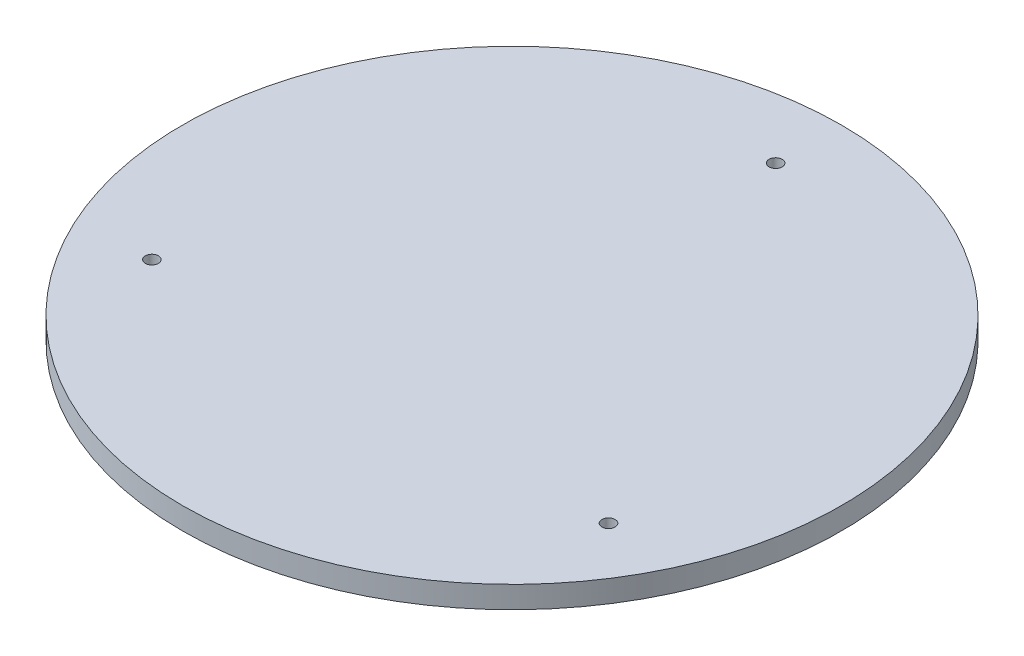
ISO-10303-21;
HEADER;
FILE_DESCRIPTION(('STEP AP214'),'2;1');
FILE_NAME('part.step','',(''),(''),'','','');
FILE_SCHEMA(('AUTOMOTIVE_DESIGN { 1 0 10303 214 1 1 1 1 }'));
ENDSEC;
DATA;
#1=APPLICATION_CONTEXT('core data for automotive mechanical design processes');
#2=APPLICATION_PROTOCOL_DEFINITION('international standard','automotive_design',2000,#1);
#3=PRODUCT_CONTEXT('',#1,'mechanical');
#4=PRODUCT('Part','Part','',(#3));
#5=PRODUCT_RELATED_PRODUCT_CATEGORY('part','',(#4));
#6=PRODUCT_DEFINITION_FORMATION('','',#4);
#7=PRODUCT_DEFINITION_CONTEXT('part definition',#1,'design');
#8=PRODUCT_DEFINITION('design','',#6,#7);
#9=PRODUCT_DEFINITION_SHAPE('','',#8);
#10=(LENGTH_UNIT() NAMED_UNIT(*) SI_UNIT(.MILLI.,.METRE.));
#11=(NAMED_UNIT(*) PLANE_ANGLE_UNIT() SI_UNIT($,.RADIAN.));
#12=(NAMED_UNIT(*) SI_UNIT($,.STERADIAN.) SOLID_ANGLE_UNIT());
#13=UNCERTAINTY_MEASURE_WITH_UNIT(LENGTH_MEASURE(1.E-05),#10,'distance_accuracy_value','');
#14=(GEOMETRIC_REPRESENTATION_CONTEXT(3) GLOBAL_UNCERTAINTY_ASSIGNED_CONTEXT((#13)) GLOBAL_UNIT_ASSIGNED_CONTEXT((#10,
#11,#12)) REPRESENTATION_CONTEXT('',''));
#15=CARTESIAN_POINT('',(0.,0.,0.));
#16=DIRECTION('',(0.,0.,1.));
#17=DIRECTION('',(1.,0.,0.));
#18=AXIS2_PLACEMENT_3D('',#15,#16,#17);
#19=CARTESIAN_POINT('',(0.,5.,0.));
#20=DIRECTION('',(0.,-1.,0.));
#21=DIRECTION('',(0.,0.,-1.));
#22=AXIS2_PLACEMENT_3D('',#19,#20,#21);
#23=CYLINDRICAL_SURFACE('',#22,75.);
#24=CARTESIAN_POINT('',(0.,5.,0.));
#25=DIRECTION('',(0.,1.,0.));
#26=DIRECTION('',(0.,0.,1.));
#27=AXIS2_PLACEMENT_3D('',#24,#25,#26);
#28=CIRCLE('',#27,75.);
#29=CARTESIAN_POINT('',(0.,5.,75.));
#30=VERTEX_POINT('',#29);
#31=EDGE_CURVE('E10',#30,#30,#28,.T.);
#32=ORIENTED_EDGE('',*,*,#31,.F.);
#33=EDGE_LOOP('',(#32));
#34=FACE_BOUND('',#33,.T.);
#35=CARTESIAN_POINT('',(0.,0.,0.));
#36=DIRECTION('',(0.,1.,0.));
#37=DIRECTION('',(0.,0.,1.));
#38=AXIS2_PLACEMENT_3D('',#35,#36,#37);
#39=CIRCLE('',#38,75.);
#40=CARTESIAN_POINT('',(0.,0.,75.));
#41=VERTEX_POINT('',#40);
#42=EDGE_CURVE('E37',#41,#41,#39,.T.);
#43=ORIENTED_EDGE('',*,*,#42,.T.);
#44=EDGE_LOOP('',(#43));
#45=FACE_BOUND('',#44,.T.);
#46=ADVANCED_FACE('F34',(#34,#45),#23,.T.);
#47=CARTESIAN_POINT('',(0.,5.,0.));
#48=DIRECTION('',(0.,1.,0.));
#49=DIRECTION('',(0.,0.,1.));
#50=AXIS2_PLACEMENT_3D('',#47,#48,#49);
#51=PLANE('',#50);
#52=CARTESIAN_POINT('',(0.,5.,-60.));
#53=DIRECTION('',(0.,1.,0.));
#54=DIRECTION('',(0.,0.,1.));
#55=AXIS2_PLACEMENT_3D('',#52,#53,#54);
#56=CIRCLE('',#55,1.5);
#57=CARTESIAN_POINT('',(0.,5.,-58.5));
#58=VERTEX_POINT('',#57);
#59=EDGE_CURVE('E58',#58,#58,#56,.T.);
#60=ORIENTED_EDGE('',*,*,#59,.F.);
#61=EDGE_LOOP('',(#60));
#62=FACE_BOUND('',#61,.T.);
#63=CARTESIAN_POINT('',(51.9615242270681,5.,30.0000000000014));
#64=DIRECTION('',(0.,1.,0.));
#65=DIRECTION('',(0.,0.,1.));
#66=AXIS2_PLACEMENT_3D('',#63,#64,#65);
#67=CIRCLE('',#66,1.50000000000002);
#68=CARTESIAN_POINT('',(51.9615242270681,5.,31.5000000000014));
#69=VERTEX_POINT('',#68);
#70=EDGE_CURVE('E52',#69,#69,#67,.T.);
#71=ORIENTED_EDGE('',*,*,#70,.F.);
#72=EDGE_LOOP('',(#71));
#73=FACE_BOUND('',#72,.T.);
#74=CARTESIAN_POINT('',(-51.9615242270667,5.,30.0000000000023));
#75=DIRECTION('',(0.,1.,0.));
#76=DIRECTION('',(0.,0.,1.));
#77=AXIS2_PLACEMENT_3D('',#74,#75,#76);
#78=CIRCLE('',#77,1.5);
#79=CARTESIAN_POINT('',(-51.9615242270667,5.,31.5000000000023));
#80=VERTEX_POINT('',#79);
#81=EDGE_CURVE('E46',#80,#80,#78,.T.);
#82=ORIENTED_EDGE('',*,*,#81,.F.);
#83=EDGE_LOOP('',(#82));
#84=FACE_BOUND('',#83,.T.);
#85=ORIENTED_EDGE('',*,*,#31,.T.);
#86=EDGE_LOOP('',(#85));
#87=FACE_BOUND('',#86,.T.);
#88=ADVANCED_FACE('F74',(#62,#73,#84,#87),#51,.T.);
#89=CARTESIAN_POINT('',(0.,0.,0.));
#90=DIRECTION('',(0.,1.,0.));
#91=DIRECTION('',(0.,0.,1.));
#92=AXIS2_PLACEMENT_3D('',#89,#90,#91);
#93=PLANE('',#92);
#94=CARTESIAN_POINT('',(0.,0.,-60.));
#95=DIRECTION('',(0.,1.,0.));
#96=DIRECTION('',(0.,0.,1.));
#97=AXIS2_PLACEMENT_3D('',#94,#95,#96);
#98=CIRCLE('',#97,1.5);
#99=CARTESIAN_POINT('',(0.,0.,-58.5));
#100=VERTEX_POINT('',#99);
#101=EDGE_CURVE('E44',#100,#100,#98,.T.);
#102=ORIENTED_EDGE('',*,*,#101,.T.);
#103=EDGE_LOOP('',(#102));
#104=FACE_BOUND('',#103,.T.);
#105=CARTESIAN_POINT('',(51.9615242270681,0.,30.0000000000014));
#106=DIRECTION('',(0.,1.,0.));
#107=DIRECTION('',(0.,0.,1.));
#108=AXIS2_PLACEMENT_3D('',#105,#106,#107);
#109=CIRCLE('',#108,1.50000000000002);
#110=CARTESIAN_POINT('',(51.9615242270681,0.,31.5000000000014));
#111=VERTEX_POINT('',#110);
#112=EDGE_CURVE('E55',#111,#111,#109,.T.);
#113=ORIENTED_EDGE('',*,*,#112,.T.);
#114=EDGE_LOOP('',(#113));
#115=FACE_BOUND('',#114,.T.);
#116=CARTESIAN_POINT('',(-51.9615242270667,0.,30.0000000000023));
#117=DIRECTION('',(0.,1.,0.));
#118=DIRECTION('',(0.,0.,1.));
#119=AXIS2_PLACEMENT_3D('',#116,#117,#118);
#120=CIRCLE('',#119,1.5);
#121=CARTESIAN_POINT('',(-51.9615242270667,0.,31.5000000000023));
#122=VERTEX_POINT('',#121);
#123=EDGE_CURVE('E49',#122,#122,#120,.T.);
#124=ORIENTED_EDGE('',*,*,#123,.T.);
#125=EDGE_LOOP('',(#124));
#126=FACE_BOUND('',#125,.T.);
#127=ORIENTED_EDGE('',*,*,#42,.F.);
#128=EDGE_LOOP('',(#127));
#129=FACE_BOUND('',#128,.T.);
#130=ADVANCED_FACE('F64',(#104,#115,#126,#129),#93,.F.);
#131=CARTESIAN_POINT('',(-51.9615242270667,0.,30.0000000000023));
#132=DIRECTION('',(0.,1.,0.));
#133=DIRECTION('',(0.,0.,1.));
#134=AXIS2_PLACEMENT_3D('',#131,#132,#133);
#135=CYLINDRICAL_SURFACE('',#134,1.5);
#136=ORIENTED_EDGE('',*,*,#123,.F.);
#137=EDGE_LOOP('',(#136));
#138=FACE_BOUND('',#137,.T.);
#139=ORIENTED_EDGE('',*,*,#81,.T.);
#140=EDGE_LOOP('',(#139));
#141=FACE_BOUND('',#140,.T.);
#142=ADVANCED_FACE('F82',(#138,#141),#135,.F.);
#143=CARTESIAN_POINT('',(51.9615242270681,0.,30.0000000000014));
#144=DIRECTION('',(0.,1.,0.));
#145=DIRECTION('',(0.,0.,1.));
#146=AXIS2_PLACEMENT_3D('',#143,#144,#145);
#147=CYLINDRICAL_SURFACE('',#146,1.50000000000002);
#148=ORIENTED_EDGE('',*,*,#112,.F.);
#149=EDGE_LOOP('',(#148));
#150=FACE_BOUND('',#149,.T.);
#151=ORIENTED_EDGE('',*,*,#70,.T.);
#152=EDGE_LOOP('',(#151));
#153=FACE_BOUND('',#152,.T.);
#154=ADVANCED_FACE('F70',(#150,#153),#147,.F.);
#155=CARTESIAN_POINT('',(0.,0.,-60.));
#156=DIRECTION('',(0.,1.,0.));
#157=DIRECTION('',(0.,0.,1.));
#158=AXIS2_PLACEMENT_3D('',#155,#156,#157);
#159=CYLINDRICAL_SURFACE('',#158,1.5);
#160=ORIENTED_EDGE('',*,*,#101,.F.);
#161=EDGE_LOOP('',(#160));
#162=FACE_BOUND('',#161,.T.);
#163=ORIENTED_EDGE('',*,*,#59,.T.);
#164=EDGE_LOOP('',(#163));
#165=FACE_BOUND('',#164,.T.);
#166=ADVANCED_FACE('F67',(#162,#165),#159,.F.);
#167=CLOSED_SHELL('',(#46,#88,#130,#142,#154,#166));
#168=MANIFOLD_SOLID_BREP('B2',#167);
#169=ADVANCED_BREP_SHAPE_REPRESENTATION('',(#18,#168),#14);
#170=SHAPE_DEFINITION_REPRESENTATION(#9,#169);
ENDSEC;
END-ISO-10303-21;
